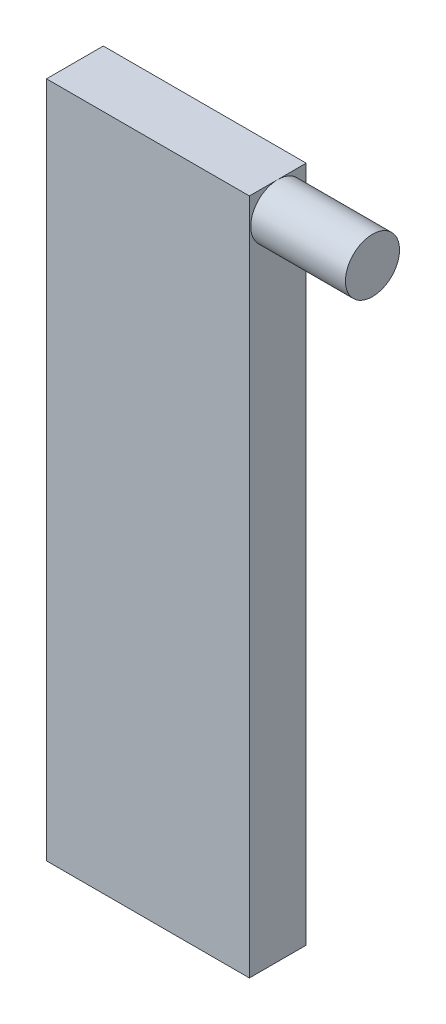
ISO-10303-21;
HEADER;
FILE_DESCRIPTION(('STEP AP214'),'2;1');
FILE_NAME('part.step','',(''),(''),'','','');
FILE_SCHEMA(('AUTOMOTIVE_DESIGN { 1 0 10303 214 1 1 1 1 }'));
ENDSEC;
DATA;
#1=APPLICATION_CONTEXT('core data for automotive mechanical design processes');
#2=APPLICATION_PROTOCOL_DEFINITION('international standard','automotive_design',2000,#1);
#3=PRODUCT_CONTEXT('',#1,'mechanical');
#4=PRODUCT('Part','Part','',(#3));
#5=PRODUCT_RELATED_PRODUCT_CATEGORY('part','',(#4));
#6=PRODUCT_DEFINITION_FORMATION('','',#4);
#7=PRODUCT_DEFINITION_CONTEXT('part definition',#1,'design');
#8=PRODUCT_DEFINITION('design','',#6,#7);
#9=PRODUCT_DEFINITION_SHAPE('','',#8);
#10=(LENGTH_UNIT() NAMED_UNIT(*) SI_UNIT(.MILLI.,.METRE.));
#11=(NAMED_UNIT(*) PLANE_ANGLE_UNIT() SI_UNIT($,.RADIAN.));
#12=(NAMED_UNIT(*) SI_UNIT($,.STERADIAN.) SOLID_ANGLE_UNIT());
#13=UNCERTAINTY_MEASURE_WITH_UNIT(LENGTH_MEASURE(1.E-05),#10,'distance_accuracy_value','');
#14=(GEOMETRIC_REPRESENTATION_CONTEXT(3) GLOBAL_UNCERTAINTY_ASSIGNED_CONTEXT((#13)) GLOBAL_UNIT_ASSIGNED_CONTEXT((#10,
#11,#12)) REPRESENTATION_CONTEXT('',''));
#15=CARTESIAN_POINT('',(0.,0.,0.));
#16=DIRECTION('',(0.,0.,1.));
#17=DIRECTION('',(1.,0.,0.));
#18=AXIS2_PLACEMENT_3D('',#15,#16,#17);
#19=CARTESIAN_POINT('',(-65.3082857070027,-126.360582189143,4.2));
#20=DIRECTION('',(1.,0.,0.));
#21=DIRECTION('',(0.,1.,0.));
#22=AXIS2_PLACEMENT_3D('',#19,#20,#21);
#23=PLANE('',#22);
#24=DIRECTION('',(0.,-1.,0.));
#25=VECTOR('',#24,1.);
#26=CARTESIAN_POINT('',(-65.3082857070027,-126.360582189143,0.));
#27=LINE('',#26,#25);
#28=CARTESIAN_POINT('',(-65.3082857070027,-126.360582189143,0.));
#29=VERTEX_POINT('',#28);
#30=CARTESIAN_POINT('',(-65.3082857070026,-176.430582189143,0.));
#31=VERTEX_POINT('',#30);
#32=EDGE_CURVE('E105',#29,#31,#27,.T.);
#33=ORIENTED_EDGE('',*,*,#32,.T.);
#34=DIRECTION('',(0.,0.,-1.));
#35=VECTOR('',#34,1.);
#36=CARTESIAN_POINT('',(-65.3082857070026,-176.430582189143,4.2));
#37=LINE('',#36,#35);
#38=CARTESIAN_POINT('',(-65.3082857070026,-176.430582189143,4.2));
#39=VERTEX_POINT('',#38);
#40=EDGE_CURVE('E11',#39,#31,#37,.T.);
#41=ORIENTED_EDGE('',*,*,#40,.F.);
#42=DIRECTION('',(0.,-1.,0.));
#43=VECTOR('',#42,1.);
#44=CARTESIAN_POINT('',(-65.3082857070027,-126.360582189143,4.2));
#45=LINE('',#44,#43);
#46=CARTESIAN_POINT('',(-65.3082857070027,-126.360582189143,4.2));
#47=VERTEX_POINT('',#46);
#48=EDGE_CURVE('E104',#47,#39,#45,.T.);
#49=ORIENTED_EDGE('',*,*,#48,.F.);
#50=DIRECTION('',(0.,0.,-1.));
#51=VECTOR('',#50,1.);
#52=CARTESIAN_POINT('',(-65.3082857070027,-126.360582189143,4.2));
#53=LINE('',#52,#51);
#54=EDGE_CURVE('E95',#47,#29,#53,.T.);
#55=ORIENTED_EDGE('',*,*,#54,.T.);
#56=EDGE_LOOP('',(#33,#41,#49,#55));
#57=FACE_BOUND('',#56,.T.);
#58=ADVANCED_FACE('F35',(#57),#23,.F.);
#59=CARTESIAN_POINT('',(-65.3082857070026,-176.430582189143,4.2));
#60=DIRECTION('',(0.,1.,0.));
#61=DIRECTION('',(0.,0.,1.));
#62=AXIS2_PLACEMENT_3D('',#59,#60,#61);
#63=PLANE('',#62);
#64=DIRECTION('',(1.,0.,0.));
#65=VECTOR('',#64,1.);
#66=CARTESIAN_POINT('',(-65.3082857070026,-176.430582189143,0.));
#67=LINE('',#66,#65);
#68=CARTESIAN_POINT('',(-50.3082857070026,-176.430582189143,0.));
#69=VERTEX_POINT('',#68);
#70=EDGE_CURVE('E102',#31,#69,#67,.T.);
#71=ORIENTED_EDGE('',*,*,#70,.T.);
#72=DIRECTION('',(0.,0.,-1.));
#73=VECTOR('',#72,1.);
#74=CARTESIAN_POINT('',(-50.3082857070026,-176.430582189143,4.2));
#75=LINE('',#74,#73);
#76=CARTESIAN_POINT('',(-50.3082857070026,-176.430582189143,4.2));
#77=VERTEX_POINT('',#76);
#78=EDGE_CURVE('E43',#77,#69,#75,.T.);
#79=ORIENTED_EDGE('',*,*,#78,.F.);
#80=DIRECTION('',(1.,0.,0.));
#81=VECTOR('',#80,1.);
#82=CARTESIAN_POINT('',(-65.3082857070026,-176.430582189143,4.2));
#83=LINE('',#82,#81);
#84=EDGE_CURVE('E80',#39,#77,#83,.T.);
#85=ORIENTED_EDGE('',*,*,#84,.F.);
#86=ORIENTED_EDGE('',*,*,#40,.T.);
#87=EDGE_LOOP('',(#71,#79,#85,#86));
#88=FACE_BOUND('',#87,.T.);
#89=ADVANCED_FACE('F134',(#88),#63,.F.);
#90=CARTESIAN_POINT('',(-50.3082857070027,-126.360582189143,4.2));
#91=DIRECTION('',(-1.,0.,0.));
#92=DIRECTION('',(0.,-1.,0.));
#93=AXIS2_PLACEMENT_3D('',#90,#91,#92);
#94=PLANE('',#93);
#95=DIRECTION('',(0.,0.,-1.));
#96=VECTOR('',#95,1.);
#97=CARTESIAN_POINT('',(-50.3082857070027,-126.360582189143,4.2));
#98=LINE('',#97,#96);
#99=CARTESIAN_POINT('',(-50.3082857070027,-126.360582189143,2.1));
#100=VERTEX_POINT('',#99);
#101=CARTESIAN_POINT('',(-50.3082857070027,-126.360582189143,0.));
#102=VERTEX_POINT('',#101);
#103=EDGE_CURVE('E69',#100,#102,#98,.T.);
#104=ORIENTED_EDGE('',*,*,#103,.F.);
#105=CARTESIAN_POINT('',(-50.3082857070027,-128.360582189143,2.1));
#106=DIRECTION('',(1.,0.,0.));
#107=DIRECTION('',(0.,1.,0.));
#108=AXIS2_PLACEMENT_3D('',#105,#106,#107);
#109=CIRCLE('',#108,2.);
#110=EDGE_CURVE('E91',#100,#100,#109,.T.);
#111=ORIENTED_EDGE('',*,*,#110,.F.);
#112=CARTESIAN_POINT('',(-50.3082857070027,-126.360582189143,4.2));
#113=VERTEX_POINT('',#112);
#114=EDGE_CURVE('E83',#113,#100,#98,.T.);
#115=ORIENTED_EDGE('',*,*,#114,.F.);
#116=DIRECTION('',(0.,1.,0.));
#117=VECTOR('',#116,1.);
#118=CARTESIAN_POINT('',(-50.3082857070027,-126.360582189143,4.2));
#119=LINE('',#118,#117);
#120=EDGE_CURVE('E98',#77,#113,#119,.T.);
#121=ORIENTED_EDGE('',*,*,#120,.F.);
#122=ORIENTED_EDGE('',*,*,#78,.T.);
#123=DIRECTION('',(0.,1.,0.));
#124=VECTOR('',#123,1.);
#125=CARTESIAN_POINT('',(-50.3082857070027,-126.360582189143,0.));
#126=LINE('',#125,#124);
#127=EDGE_CURVE('E94',#69,#102,#126,.T.);
#128=ORIENTED_EDGE('',*,*,#127,.T.);
#129=EDGE_LOOP('',(#104,#111,#115,#121,#122,#128));
#130=FACE_BOUND('',#129,.T.);
#131=ADVANCED_FACE('F89',(#130),#94,.F.);
#132=CARTESIAN_POINT('',(-65.3082857070027,-126.360582189143,4.2));
#133=DIRECTION('',(0.,-1.,0.));
#134=DIRECTION('',(0.,0.,-1.));
#135=AXIS2_PLACEMENT_3D('',#132,#133,#134);
#136=PLANE('',#135);
#137=DIRECTION('',(-1.,0.,0.));
#138=VECTOR('',#137,1.);
#139=CARTESIAN_POINT('',(-65.3082857070027,-126.360582189143,0.));
#140=LINE('',#139,#138);
#141=EDGE_CURVE('E73',#102,#29,#140,.T.);
#142=ORIENTED_EDGE('',*,*,#141,.T.);
#143=ORIENTED_EDGE('',*,*,#54,.F.);
#144=DIRECTION('',(-1.,0.,0.));
#145=VECTOR('',#144,1.);
#146=CARTESIAN_POINT('',(-65.3082857070027,-126.360582189143,4.2));
#147=LINE('',#146,#145);
#148=EDGE_CURVE('E51',#113,#47,#147,.T.);
#149=ORIENTED_EDGE('',*,*,#148,.F.);
#150=ORIENTED_EDGE('',*,*,#114,.T.);
#151=ORIENTED_EDGE('',*,*,#103,.T.);
#152=EDGE_LOOP('',(#142,#143,#149,#150,#151));
#153=FACE_BOUND('',#152,.T.);
#154=ADVANCED_FACE('F84',(#153),#136,.F.);
#155=CARTESIAN_POINT('',(0.,0.,4.2));
#156=DIRECTION('',(0.,0.,1.));
#157=DIRECTION('',(1.,0.,0.));
#158=AXIS2_PLACEMENT_3D('',#155,#156,#157);
#159=PLANE('',#158);
#160=ORIENTED_EDGE('',*,*,#48,.T.);
#161=ORIENTED_EDGE('',*,*,#84,.T.);
#162=ORIENTED_EDGE('',*,*,#120,.T.);
#163=ORIENTED_EDGE('',*,*,#148,.T.);
#164=EDGE_LOOP('',(#160,#161,#162,#163));
#165=FACE_BOUND('',#164,.T.);
#166=ADVANCED_FACE('F130',(#165),#159,.T.);
#167=CARTESIAN_POINT('',(0.,0.,0.));
#168=DIRECTION('',(0.,0.,1.));
#169=DIRECTION('',(1.,0.,0.));
#170=AXIS2_PLACEMENT_3D('',#167,#168,#169);
#171=PLANE('',#170);
#172=ORIENTED_EDGE('',*,*,#32,.F.);
#173=ORIENTED_EDGE('',*,*,#141,.F.);
#174=ORIENTED_EDGE('',*,*,#127,.F.);
#175=ORIENTED_EDGE('',*,*,#70,.F.);
#176=EDGE_LOOP('',(#172,#173,#174,#175));
#177=FACE_BOUND('',#176,.T.);
#178=ADVANCED_FACE('F101',(#177),#171,.F.);
#179=CARTESIAN_POINT('',(-43.3082857070027,-128.360582189143,2.1));
#180=DIRECTION('',(-1.,0.,0.));
#181=DIRECTION('',(0.,-1.,0.));
#182=AXIS2_PLACEMENT_3D('',#179,#180,#181);
#183=CYLINDRICAL_SURFACE('',#182,2.);
#184=CARTESIAN_POINT('',(-43.3082857070027,-128.360582189143,2.1));
#185=DIRECTION('',(1.,0.,0.));
#186=DIRECTION('',(0.,1.,0.));
#187=AXIS2_PLACEMENT_3D('',#184,#185,#186);
#188=CIRCLE('',#187,2.);
#189=CARTESIAN_POINT('',(-43.3082857070027,-126.360582189143,2.1));
#190=VERTEX_POINT('',#189);
#191=EDGE_CURVE('E110',#190,#190,#188,.T.);
#192=ORIENTED_EDGE('',*,*,#191,.F.);
#193=EDGE_LOOP('',(#192));
#194=FACE_BOUND('',#193,.T.);
#195=ORIENTED_EDGE('',*,*,#110,.T.);
#196=EDGE_LOOP('',(#195));
#197=FACE_BOUND('',#196,.T.);
#198=ADVANCED_FACE('F121',(#194,#197),#183,.T.);
#199=CARTESIAN_POINT('',(-43.3082857070027,-128.360582189143,2.1));
#200=DIRECTION('',(1.,0.,0.));
#201=DIRECTION('',(0.,1.,0.));
#202=AXIS2_PLACEMENT_3D('',#199,#200,#201);
#203=PLANE('',#202);
#204=ORIENTED_EDGE('',*,*,#191,.T.);
#205=EDGE_LOOP('',(#204));
#206=FACE_BOUND('',#205,.T.);
#207=ADVANCED_FACE('F119',(#206),#203,.T.);
#208=CLOSED_SHELL('',(#58,#89,#131,#154,#166,#178,#198,#207));
#209=MANIFOLD_SOLID_BREP('B2',#208);
#210=ADVANCED_BREP_SHAPE_REPRESENTATION('',(#18,#209),#14);
#211=SHAPE_DEFINITION_REPRESENTATION(#9,#210);
ENDSEC;
END-ISO-10303-21;
